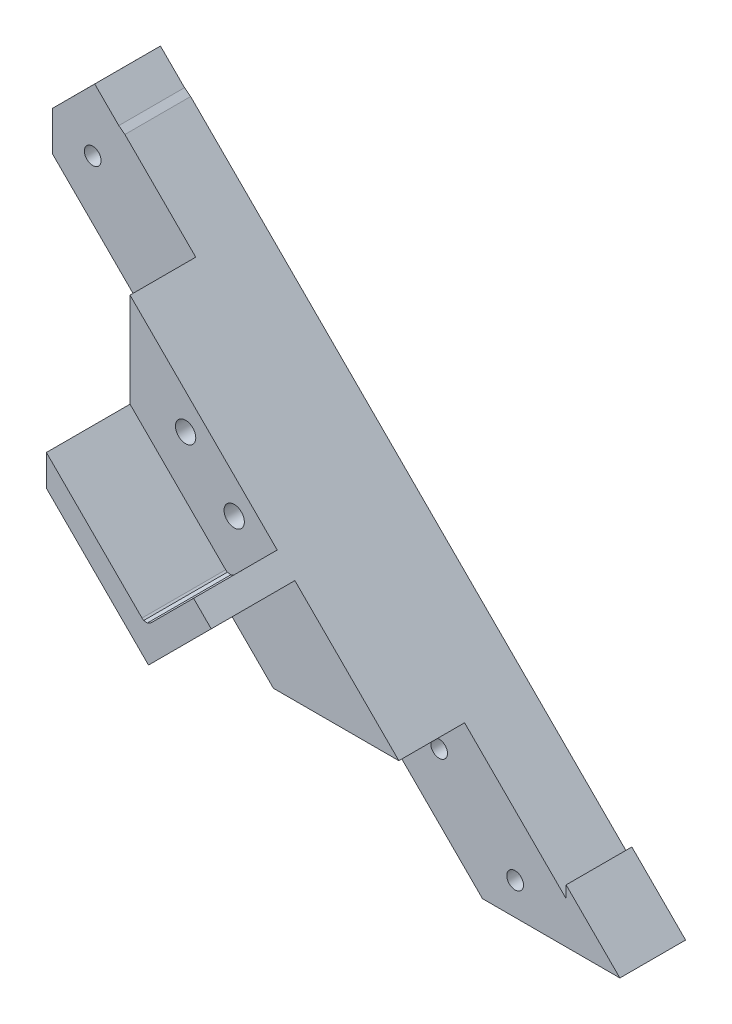
ISO-10303-21;
HEADER;
FILE_DESCRIPTION(('STEP AP214'),'2;1');
FILE_NAME('part.step','',(''),(''),'','','');
FILE_SCHEMA(('AUTOMOTIVE_DESIGN { 1 0 10303 214 1 1 1 1 }'));
ENDSEC;
DATA;
#1=APPLICATION_CONTEXT('core data for automotive mechanical design processes');
#2=APPLICATION_PROTOCOL_DEFINITION('international standard','automotive_design',2000,#1);
#3=PRODUCT_CONTEXT('',#1,'mechanical');
#4=PRODUCT('Part','Part','',(#3));
#5=PRODUCT_RELATED_PRODUCT_CATEGORY('part','',(#4));
#6=PRODUCT_DEFINITION_FORMATION('','',#4);
#7=PRODUCT_DEFINITION_CONTEXT('part definition',#1,'design');
#8=PRODUCT_DEFINITION('design','',#6,#7);
#9=PRODUCT_DEFINITION_SHAPE('','',#8);
#10=(LENGTH_UNIT() NAMED_UNIT(*) SI_UNIT(.MILLI.,.METRE.));
#11=(NAMED_UNIT(*) PLANE_ANGLE_UNIT() SI_UNIT($,.RADIAN.));
#12=(NAMED_UNIT(*) SI_UNIT($,.STERADIAN.) SOLID_ANGLE_UNIT());
#13=UNCERTAINTY_MEASURE_WITH_UNIT(LENGTH_MEASURE(1.E-05),#10,'distance_accuracy_value','');
#14=(GEOMETRIC_REPRESENTATION_CONTEXT(3) GLOBAL_UNCERTAINTY_ASSIGNED_CONTEXT((#13)) GLOBAL_UNIT_ASSIGNED_CONTEXT((#10,
#11,#12)) REPRESENTATION_CONTEXT('',''));
#15=CARTESIAN_POINT('',(0.,0.,0.));
#16=DIRECTION('',(0.,0.,1.));
#17=DIRECTION('',(1.,0.,0.));
#18=AXIS2_PLACEMENT_3D('',#15,#16,#17);
#19=CARTESIAN_POINT('',(78.736679994962,32.118448210166,41.));
#20=DIRECTION('',(0.,0.,1.));
#21=DIRECTION('',(1.,0.,0.));
#22=AXIS2_PLACEMENT_3D('',#19,#20,#21);
#23=PLANE('',#22);
#24=CARTESIAN_POINT('',(78.736679994962,32.118448210166,41.));
#25=DIRECTION('',(0.,0.,1.));
#26=DIRECTION('',(1.,0.,0.));
#27=AXIS2_PLACEMENT_3D('',#24,#25,#26);
#28=CIRCLE('',#27,1.4);
#29=CARTESIAN_POINT('',(80.136679994962,32.118448210166,41.));
#30=VERTEX_POINT('',#29);
#31=EDGE_CURVE('E9',#30,#30,#28,.T.);
#32=ORIENTED_EDGE('',*,*,#31,.T.);
#33=EDGE_LOOP('',(#32));
#34=FACE_BOUND('',#33,.T.);
#35=ADVANCED_FACE('F14',(#34),#23,.T.);
#36=CARTESIAN_POINT('',(91.46460205632,19.390526148808,41.));
#37=DIRECTION('',(0.,0.,1.));
#38=DIRECTION('',(1.,0.,0.));
#39=AXIS2_PLACEMENT_3D('',#36,#37,#38);
#40=PLANE('',#39);
#41=CARTESIAN_POINT('',(91.46460205632,19.390526148808,41.));
#42=DIRECTION('',(0.,0.,1.));
#43=DIRECTION('',(1.,0.,0.));
#44=AXIS2_PLACEMENT_3D('',#41,#42,#43);
#45=CIRCLE('',#44,1.4);
#46=CARTESIAN_POINT('',(92.86460205632,19.390526148808,41.));
#47=VERTEX_POINT('',#46);
#48=EDGE_CURVE('E401',#47,#47,#45,.T.);
#49=ORIENTED_EDGE('',*,*,#48,.T.);
#50=EDGE_LOOP('',(#49));
#51=FACE_BOUND('',#50,.T.);
#52=ADVANCED_FACE('F678',(#51),#40,.T.);
#53=CARTESIAN_POINT('',(20.751099636774,89.064753007087,41.));
#54=DIRECTION('',(0.,0.,1.));
#55=DIRECTION('',(1.,0.,0.));
#56=AXIS2_PLACEMENT_3D('',#53,#54,#55);
#57=PLANE('',#56);
#58=CARTESIAN_POINT('',(20.751099636774,89.064753007087,41.));
#59=DIRECTION('',(0.,0.,1.));
#60=DIRECTION('',(1.,0.,0.));
#61=AXIS2_PLACEMENT_3D('',#58,#59,#60);
#62=CIRCLE('',#61,1.4);
#63=CARTESIAN_POINT('',(22.151099636774,89.064753007087,41.));
#64=VERTEX_POINT('',#63);
#65=EDGE_CURVE('E365',#64,#64,#62,.T.);
#66=ORIENTED_EDGE('',*,*,#65,.T.);
#67=EDGE_LOOP('',(#66));
#68=FACE_BOUND('',#67,.T.);
#69=ADVANCED_FACE('F683',(#68),#57,.T.);
#70=CARTESIAN_POINT('',(33.479021698131,76.33683094573,41.));
#71=DIRECTION('',(0.,0.,1.));
#72=DIRECTION('',(1.,0.,0.));
#73=AXIS2_PLACEMENT_3D('',#70,#71,#72);
#74=PLANE('',#73);
#75=CARTESIAN_POINT('',(33.479021698131,76.33683094573,41.));
#76=DIRECTION('',(0.,0.,1.));
#77=DIRECTION('',(1.,0.,0.));
#78=AXIS2_PLACEMENT_3D('',#75,#76,#77);
#79=CIRCLE('',#78,1.4);
#80=CARTESIAN_POINT('',(34.879021698131,76.33683094573,41.));
#81=VERTEX_POINT('',#80);
#82=EDGE_CURVE('E495',#81,#81,#79,.T.);
#83=ORIENTED_EDGE('',*,*,#82,.T.);
#84=EDGE_LOOP('',(#83));
#85=FACE_BOUND('',#84,.T.);
#86=ADVANCED_FACE('F699',(#85),#74,.T.);
#87=CARTESIAN_POINT('',(47.30544366138,67.81154031579,43.9));
#88=DIRECTION('',(0.,0.,1.));
#89=DIRECTION('',(1.,0.,0.));
#90=AXIS2_PLACEMENT_3D('',#87,#88,#89);
#91=PLANE('',#90);
#92=CARTESIAN_POINT('',(47.30544366138,67.81154031579,43.9));
#93=DIRECTION('',(0.,0.,1.));
#94=DIRECTION('',(1.,0.,0.));
#95=AXIS2_PLACEMENT_3D('',#92,#93,#94);
#96=CIRCLE('',#95,1.7);
#97=CARTESIAN_POINT('',(49.00544366138,67.81154031579,43.9));
#98=VERTEX_POINT('',#97);
#99=EDGE_CURVE('E331',#98,#98,#96,.T.);
#100=ORIENTED_EDGE('',*,*,#99,.T.);
#101=EDGE_LOOP('',(#100));
#102=FACE_BOUND('',#101,.T.);
#103=CARTESIAN_POINT('',(47.30544366138,67.81154031579,43.9));
#104=DIRECTION('',(0.,0.,1.));
#105=DIRECTION('',(1.,0.,0.));
#106=AXIS2_PLACEMENT_3D('',#103,#104,#105);
#107=CIRCLE('',#106,3.6);
#108=CARTESIAN_POINT('',(50.90544366138,67.81154031579,43.9));
#109=VERTEX_POINT('',#108);
#110=EDGE_CURVE('E402',#109,#109,#107,.T.);
#111=ORIENTED_EDGE('',*,*,#110,.F.);
#112=EDGE_LOOP('',(#111));
#113=FACE_BOUND('',#112,.T.);
#114=ADVANCED_FACE('F16',(#102,#113),#91,.F.);
#115=CARTESIAN_POINT('',(55.437171645025,59.679812332145,43.9));
#116=DIRECTION('',(0.,0.,1.));
#117=DIRECTION('',(1.,0.,0.));
#118=AXIS2_PLACEMENT_3D('',#115,#116,#117);
#119=PLANE('',#118);
#120=CARTESIAN_POINT('',(55.437171645025,59.679812332145,43.9));
#121=DIRECTION('',(0.,0.,1.));
#122=DIRECTION('',(1.,0.,0.));
#123=AXIS2_PLACEMENT_3D('',#120,#121,#122);
#124=CIRCLE('',#123,1.7);
#125=CARTESIAN_POINT('',(57.137171645025,59.679812332145,43.9));
#126=VERTEX_POINT('',#125);
#127=EDGE_CURVE('E322',#126,#126,#124,.T.);
#128=ORIENTED_EDGE('',*,*,#127,.T.);
#129=EDGE_LOOP('',(#128));
#130=FACE_BOUND('',#129,.T.);
#131=CARTESIAN_POINT('',(55.437171645025,59.679812332145,43.9));
#132=DIRECTION('',(0.,0.,1.));
#133=DIRECTION('',(1.,0.,0.));
#134=AXIS2_PLACEMENT_3D('',#131,#132,#133);
#135=CIRCLE('',#134,3.6);
#136=CARTESIAN_POINT('',(59.037171645025,59.679812332145,43.9));
#137=VERTEX_POINT('',#136);
#138=EDGE_CURVE('E532',#137,#137,#135,.T.);
#139=ORIENTED_EDGE('',*,*,#138,.F.);
#140=EDGE_LOOP('',(#139));
#141=FACE_BOUND('',#140,.T.);
#142=ADVANCED_FACE('F746',(#130,#141),#119,.F.);
#143=CARTESIAN_POINT('',(78.736679994962,32.118448210166,41.));
#144=DIRECTION('',(0.,0.,1.));
#145=DIRECTION('',(1.,0.,0.));
#146=AXIS2_PLACEMENT_3D('',#143,#144,#145);
#147=CYLINDRICAL_SURFACE('',#146,1.4);
#148=DIRECTION('',(0.,0.,1.));
#149=VECTOR('',#148,1.);
#150=CARTESIAN_POINT('',(80.136679994962,32.118448210166,41.));
#151=LINE('',#150,#149);
#152=CARTESIAN_POINT('',(80.136679994962,32.118448210166,51.));
#153=VERTEX_POINT('',#152);
#154=EDGE_CURVE('E25',#30,#153,#151,.T.);
#155=ORIENTED_EDGE('',*,*,#154,.F.);
#156=ORIENTED_EDGE('',*,*,#31,.F.);
#157=ORIENTED_EDGE('',*,*,#154,.T.);
#158=CARTESIAN_POINT('',(78.736679994962,32.118448210166,51.));
#159=DIRECTION('',(0.,0.,1.));
#160=DIRECTION('',(1.,0.,0.));
#161=AXIS2_PLACEMENT_3D('',#158,#159,#160);
#162=CIRCLE('',#161,1.4);
#163=EDGE_CURVE('E452',#153,#153,#162,.T.);
#164=ORIENTED_EDGE('',*,*,#163,.T.);
#165=EDGE_LOOP('',(#155,#156,#157,#164));
#166=FACE_BOUND('',#165,.T.);
#167=ADVANCED_FACE('F694',(#166),#147,.F.);
#168=CARTESIAN_POINT('',(91.46460205632,19.390526148808,41.));
#169=DIRECTION('',(0.,0.,1.));
#170=DIRECTION('',(1.,0.,0.));
#171=AXIS2_PLACEMENT_3D('',#168,#169,#170);
#172=CYLINDRICAL_SURFACE('',#171,1.4);
#173=DIRECTION('',(0.,0.,1.));
#174=VECTOR('',#173,1.);
#175=CARTESIAN_POINT('',(92.86460205632,19.390526148808,41.));
#176=LINE('',#175,#174);
#177=CARTESIAN_POINT('',(92.86460205632,19.390526148808,51.));
#178=VERTEX_POINT('',#177);
#179=EDGE_CURVE('E398',#47,#178,#176,.T.);
#180=ORIENTED_EDGE('',*,*,#179,.F.);
#181=ORIENTED_EDGE('',*,*,#48,.F.);
#182=ORIENTED_EDGE('',*,*,#179,.T.);
#183=CARTESIAN_POINT('',(91.46460205632,19.390526148808,51.));
#184=DIRECTION('',(0.,0.,1.));
#185=DIRECTION('',(1.,0.,0.));
#186=AXIS2_PLACEMENT_3D('',#183,#184,#185);
#187=CIRCLE('',#186,1.4);
#188=EDGE_CURVE('E456',#178,#178,#187,.T.);
#189=ORIENTED_EDGE('',*,*,#188,.T.);
#190=EDGE_LOOP('',(#180,#181,#182,#189));
#191=FACE_BOUND('',#190,.T.);
#192=ADVANCED_FACE('F691',(#191),#172,.F.);
#193=CARTESIAN_POINT('',(47.30544366138,67.81154031579,39.9));
#194=DIRECTION('',(0.,0.,1.));
#195=DIRECTION('',(1.,0.,0.));
#196=AXIS2_PLACEMENT_3D('',#193,#194,#195);
#197=CYLINDRICAL_SURFACE('',#196,3.6);
#198=CARTESIAN_POINT('',(47.30544366138,67.81154031579,40.));
#199=DIRECTION('',(0.,0.,1.));
#200=DIRECTION('',(1.,0.,0.));
#201=AXIS2_PLACEMENT_3D('',#198,#199,#200);
#202=CIRCLE('',#201,3.6);
#203=CARTESIAN_POINT('',(50.90544366138,67.81154031579,40.));
#204=VERTEX_POINT('',#203);
#205=EDGE_CURVE('E317',#204,#204,#202,.T.);
#206=ORIENTED_EDGE('',*,*,#205,.F.);
#207=DIRECTION('',(0.,0.,1.));
#208=VECTOR('',#207,1.);
#209=CARTESIAN_POINT('',(50.90544366138,67.81154031579,39.9));
#210=LINE('',#209,#208);
#211=EDGE_CURVE('E505',#204,#109,#210,.T.);
#212=ORIENTED_EDGE('',*,*,#211,.T.);
#213=ORIENTED_EDGE('',*,*,#110,.T.);
#214=ORIENTED_EDGE('',*,*,#211,.F.);
#215=EDGE_LOOP('',(#206,#212,#213,#214));
#216=FACE_BOUND('',#215,.T.);
#217=ADVANCED_FACE('F693',(#216),#197,.F.);
#218=CARTESIAN_POINT('',(55.437171645025,59.679812332145,39.9));
#219=DIRECTION('',(0.,0.,1.));
#220=DIRECTION('',(1.,0.,0.));
#221=AXIS2_PLACEMENT_3D('',#218,#219,#220);
#222=CYLINDRICAL_SURFACE('',#221,3.6);
#223=CARTESIAN_POINT('',(55.437171645025,59.679812332145,40.));
#224=DIRECTION('',(0.,0.,1.));
#225=DIRECTION('',(1.,0.,0.));
#226=AXIS2_PLACEMENT_3D('',#223,#224,#225);
#227=CIRCLE('',#226,3.6);
#228=CARTESIAN_POINT('',(59.037171645025,59.679812332145,40.));
#229=VERTEX_POINT('',#228);
#230=EDGE_CURVE('E18',#229,#229,#227,.T.);
#231=ORIENTED_EDGE('',*,*,#230,.F.);
#232=DIRECTION('',(0.,0.,1.));
#233=VECTOR('',#232,1.);
#234=CARTESIAN_POINT('',(59.037171645025,59.679812332145,39.9));
#235=LINE('',#234,#233);
#236=EDGE_CURVE('E364',#229,#137,#235,.T.);
#237=ORIENTED_EDGE('',*,*,#236,.T.);
#238=ORIENTED_EDGE('',*,*,#138,.T.);
#239=ORIENTED_EDGE('',*,*,#236,.F.);
#240=EDGE_LOOP('',(#231,#237,#238,#239));
#241=FACE_BOUND('',#240,.T.);
#242=ADVANCED_FACE('F705',(#241),#222,.F.);
#243=CARTESIAN_POINT('',(109.,14.,40.));
#244=DIRECTION('',(-0.707106781186548,-0.707106781186548,0.));
#245=DIRECTION('',(-0.707106781186548,0.707106781186548,0.));
#246=AXIS2_PLACEMENT_3D('',#243,#244,#245);
#247=PLANE('',#246);
#248=DIRECTION('',(-0.707106781186548,0.707106781186548,0.));
#249=VECTOR('',#248,1.);
#250=CARTESIAN_POINT('',(109.,14.,40.));
#251=LINE('',#250,#249);
#252=CARTESIAN_POINT('',(109.,14.,40.));
#253=VERTEX_POINT('',#252);
#254=CARTESIAN_POINT('',(100.,23.,40.));
#255=VERTEX_POINT('',#254);
#256=EDGE_CURVE('E308',#253,#255,#251,.T.);
#257=ORIENTED_EDGE('',*,*,#256,.T.);
#258=DIRECTION('',(0.,0.,1.));
#259=VECTOR('',#258,1.);
#260=CARTESIAN_POINT('',(100.,23.,40.));
#261=LINE('',#260,#259);
#262=CARTESIAN_POINT('',(100.,23.,51.));
#263=VERTEX_POINT('',#262);
#264=EDGE_CURVE('E316',#255,#263,#261,.T.);
#265=ORIENTED_EDGE('',*,*,#264,.T.);
#266=DIRECTION('',(-0.707106781186548,0.707106781186548,0.));
#267=VECTOR('',#266,1.);
#268=CARTESIAN_POINT('',(109.,14.,51.));
#269=LINE('',#268,#267);
#270=CARTESIAN_POINT('',(109.,14.,51.));
#271=VERTEX_POINT('',#270);
#272=EDGE_CURVE('E351',#271,#263,#269,.T.);
#273=ORIENTED_EDGE('',*,*,#272,.F.);
#274=DIRECTION('',(0.,0.,1.));
#275=VECTOR('',#274,1.);
#276=CARTESIAN_POINT('',(109.,14.,40.));
#277=LINE('',#276,#275);
#278=EDGE_CURVE('E361',#253,#271,#277,.T.);
#279=ORIENTED_EDGE('',*,*,#278,.F.);
#280=EDGE_LOOP('',(#257,#265,#273,#279));
#281=FACE_BOUND('',#280,.T.);
#282=ADVANCED_FACE('F625',(#281),#247,.F.);
#283=CARTESIAN_POINT('',(86.,14.,40.));
#284=DIRECTION('',(0.,1.,0.));
#285=DIRECTION('',(1.,0.,0.));
#286=AXIS2_PLACEMENT_3D('',#283,#284,#285);
#287=PLANE('',#286);
#288=DIRECTION('',(1.,0.,0.));
#289=VECTOR('',#288,1.);
#290=CARTESIAN_POINT('',(86.,14.,40.));
#291=LINE('',#290,#289);
#292=CARTESIAN_POINT('',(86.,14.,40.));
#293=VERTEX_POINT('',#292);
#294=EDGE_CURVE('E312',#293,#253,#291,.T.);
#295=ORIENTED_EDGE('',*,*,#294,.T.);
#296=ORIENTED_EDGE('',*,*,#278,.T.);
#297=DIRECTION('',(1.,0.,0.));
#298=VECTOR('',#297,1.);
#299=CARTESIAN_POINT('',(86.,14.,51.));
#300=LINE('',#299,#298);
#301=CARTESIAN_POINT('',(86.,14.,51.));
#302=VERTEX_POINT('',#301);
#303=EDGE_CURVE('E350',#302,#271,#300,.T.);
#304=ORIENTED_EDGE('',*,*,#303,.F.);
#305=DIRECTION('',(0.,0.,1.));
#306=VECTOR('',#305,1.);
#307=CARTESIAN_POINT('',(86.,14.,40.));
#308=LINE('',#307,#306);
#309=EDGE_CURVE('E403',#293,#302,#308,.T.);
#310=ORIENTED_EDGE('',*,*,#309,.F.);
#311=EDGE_LOOP('',(#295,#296,#304,#310));
#312=FACE_BOUND('',#311,.T.);
#313=ADVANCED_FACE('F646',(#312),#287,.F.);
#314=CARTESIAN_POINT('',(20.751099636774,89.064753007087,41.));
#315=DIRECTION('',(0.,0.,1.));
#316=DIRECTION('',(1.,0.,0.));
#317=AXIS2_PLACEMENT_3D('',#314,#315,#316);
#318=CYLINDRICAL_SURFACE('',#317,1.4);
#319=DIRECTION('',(0.,0.,1.));
#320=VECTOR('',#319,1.);
#321=CARTESIAN_POINT('',(22.151099636774,89.064753007087,41.));
#322=LINE('',#321,#320);
#323=CARTESIAN_POINT('',(22.151099636774,89.064753007087,51.));
#324=VERTEX_POINT('',#323);
#325=EDGE_CURVE('E492',#64,#324,#322,.T.);
#326=ORIENTED_EDGE('',*,*,#325,.F.);
#327=ORIENTED_EDGE('',*,*,#65,.F.);
#328=ORIENTED_EDGE('',*,*,#325,.T.);
#329=CARTESIAN_POINT('',(20.751099636774,89.064753007087,51.));
#330=DIRECTION('',(0.,0.,1.));
#331=DIRECTION('',(1.,0.,0.));
#332=AXIS2_PLACEMENT_3D('',#329,#330,#331);
#333=CIRCLE('',#332,1.4);
#334=EDGE_CURVE('E412',#324,#324,#333,.T.);
#335=ORIENTED_EDGE('',*,*,#334,.T.);
#336=EDGE_LOOP('',(#326,#327,#328,#335));
#337=FACE_BOUND('',#336,.T.);
#338=ADVANCED_FACE('F714',(#337),#318,.F.);
#339=CARTESIAN_POINT('',(33.479021698131,76.33683094573,41.));
#340=DIRECTION('',(0.,0.,1.));
#341=DIRECTION('',(1.,0.,0.));
#342=AXIS2_PLACEMENT_3D('',#339,#340,#341);
#343=CYLINDRICAL_SURFACE('',#342,1.4);
#344=DIRECTION('',(0.,0.,1.));
#345=VECTOR('',#344,1.);
#346=CARTESIAN_POINT('',(34.879021698131,76.33683094573,41.));
#347=LINE('',#346,#345);
#348=CARTESIAN_POINT('',(34.879021698131,76.33683094573,51.));
#349=VERTEX_POINT('',#348);
#350=EDGE_CURVE('E301',#81,#349,#347,.T.);
#351=ORIENTED_EDGE('',*,*,#350,.F.);
#352=ORIENTED_EDGE('',*,*,#82,.F.);
#353=ORIENTED_EDGE('',*,*,#350,.T.);
#354=CARTESIAN_POINT('',(33.479021698131,76.33683094573,51.));
#355=DIRECTION('',(0.,0.,1.));
#356=DIRECTION('',(1.,0.,0.));
#357=AXIS2_PLACEMENT_3D('',#354,#355,#356);
#358=CIRCLE('',#357,1.4);
#359=EDGE_CURVE('E306',#349,#349,#358,.T.);
#360=ORIENTED_EDGE('',*,*,#359,.T.);
#361=EDGE_LOOP('',(#351,#352,#353,#360));
#362=FACE_BOUND('',#361,.T.);
#363=ADVANCED_FACE('F722',(#362),#343,.F.);
#364=CARTESIAN_POINT('',(25.120030213303,95.629065072163,40.));
#365=DIRECTION('',(-0.706795959357822,-0.707417466447822,0.));
#366=DIRECTION('',(-0.707417466447822,0.706795959357822,0.));
#367=AXIS2_PLACEMENT_3D('',#364,#365,#366);
#368=PLANE('',#367);
#369=DIRECTION('',(-0.707417466447822,0.706795959357822,0.));
#370=VECTOR('',#369,1.);
#371=CARTESIAN_POINT('',(25.120030213303,95.629065072163,40.));
#372=LINE('',#371,#370);
#373=CARTESIAN_POINT('',(25.120030213303,95.629065072163,40.));
#374=VERTEX_POINT('',#373);
#375=CARTESIAN_POINT('',(21.089185237676,99.656368717739,40.));
#376=VERTEX_POINT('',#375);
#377=EDGE_CURVE('E393',#374,#376,#372,.T.);
#378=ORIENTED_EDGE('',*,*,#377,.T.);
#379=DIRECTION('',(0.,0.,1.));
#380=VECTOR('',#379,1.);
#381=CARTESIAN_POINT('',(21.089185237676,99.656368717739,40.));
#382=LINE('',#381,#380);
#383=CARTESIAN_POINT('',(21.089185237676,99.656368717739,51.));
#384=VERTEX_POINT('',#383);
#385=EDGE_CURVE('E449',#376,#384,#382,.T.);
#386=ORIENTED_EDGE('',*,*,#385,.T.);
#387=DIRECTION('',(-0.707417466447822,0.706795959357822,0.));
#388=VECTOR('',#387,1.);
#389=CARTESIAN_POINT('',(25.120030213303,95.629065072163,51.));
#390=LINE('',#389,#388);
#391=CARTESIAN_POINT('',(25.120030213303,95.629065072163,51.));
#392=VERTEX_POINT('',#391);
#393=EDGE_CURVE('E366',#392,#384,#390,.T.);
#394=ORIENTED_EDGE('',*,*,#393,.F.);
#395=DIRECTION('',(0.,0.,1.));
#396=VECTOR('',#395,1.);
#397=CARTESIAN_POINT('',(25.120030213303,95.629065072163,40.));
#398=LINE('',#397,#396);
#399=EDGE_CURVE('E411',#374,#392,#398,.T.);
#400=ORIENTED_EDGE('',*,*,#399,.F.);
#401=EDGE_LOOP('',(#378,#386,#394,#400));
#402=FACE_BOUND('',#401,.T.);
#403=ADVANCED_FACE('F570',(#402),#368,.F.);
#404=CARTESIAN_POINT('',(21.089185237676,99.656368717739,40.));
#405=DIRECTION('',(0.707029670829544,-0.707183883135544,0.));
#406=DIRECTION('',(0.,0.,-1.));
#407=AXIS2_PLACEMENT_3D('',#404,#405,#406);
#408=PLANE('',#407);
#409=DIRECTION('',(-0.707183883135544,-0.707029670829544,0.));
#410=VECTOR('',#409,1.);
#411=CARTESIAN_POINT('',(21.089185237676,99.656368717739,40.));
#412=LINE('',#411,#410);
#413=CARTESIAN_POINT('',(14.,92.568729385773,40.));
#414=VERTEX_POINT('',#413);
#415=EDGE_CURVE('E397',#376,#414,#412,.T.);
#416=ORIENTED_EDGE('',*,*,#415,.T.);
#417=DIRECTION('',(0.,0.,1.));
#418=VECTOR('',#417,1.);
#419=CARTESIAN_POINT('',(14.,92.568729385773,40.));
#420=LINE('',#419,#418);
#421=CARTESIAN_POINT('',(14.,92.568729385773,51.));
#422=VERTEX_POINT('',#421);
#423=EDGE_CURVE('E334',#414,#422,#420,.T.);
#424=ORIENTED_EDGE('',*,*,#423,.T.);
#425=DIRECTION('',(-0.707183883135544,-0.707029670829544,0.));
#426=VECTOR('',#425,1.);
#427=CARTESIAN_POINT('',(21.089185237676,99.656368717739,51.));
#428=LINE('',#427,#426);
#429=EDGE_CURVE('E307',#384,#422,#428,.T.);
#430=ORIENTED_EDGE('',*,*,#429,.F.);
#431=ORIENTED_EDGE('',*,*,#385,.F.);
#432=EDGE_LOOP('',(#416,#424,#430,#431));
#433=FACE_BOUND('',#432,.T.);
#434=ADVANCED_FACE('F556',(#433),#408,.F.);
#435=CARTESIAN_POINT('',(14.,92.568729385773,40.));
#436=DIRECTION('',(1.,0.,0.));
#437=DIRECTION('',(0.,1.,0.));
#438=AXIS2_PLACEMENT_3D('',#435,#436,#437);
#439=PLANE('',#438);
#440=DIRECTION('',(0.,-1.,0.));
#441=VECTOR('',#440,1.);
#442=CARTESIAN_POINT('',(14.,92.568729385773,40.));
#443=LINE('',#442,#441);
#444=CARTESIAN_POINT('',(14.,86.,40.));
#445=VERTEX_POINT('',#444);
#446=EDGE_CURVE('E416',#414,#445,#443,.T.);
#447=ORIENTED_EDGE('',*,*,#446,.T.);
#448=DIRECTION('',(0.,0.,1.));
#449=VECTOR('',#448,1.);
#450=CARTESIAN_POINT('',(14.,86.,40.));
#451=LINE('',#450,#449);
#452=CARTESIAN_POINT('',(14.,86.,51.));
#453=VERTEX_POINT('',#452);
#454=EDGE_CURVE('E406',#445,#453,#451,.T.);
#455=ORIENTED_EDGE('',*,*,#454,.T.);
#456=DIRECTION('',(0.,-1.,0.));
#457=VECTOR('',#456,1.);
#458=CARTESIAN_POINT('',(14.,92.568729385773,51.));
#459=LINE('',#458,#457);
#460=EDGE_CURVE('E303',#422,#453,#459,.T.);
#461=ORIENTED_EDGE('',*,*,#460,.F.);
#462=ORIENTED_EDGE('',*,*,#423,.F.);
#463=EDGE_LOOP('',(#447,#455,#461,#462));
#464=FACE_BOUND('',#463,.T.);
#465=ADVANCED_FACE('F562',(#464),#439,.F.);
#466=CARTESIAN_POINT('',(47.30544366138,67.81154031579,39.9));
#467=DIRECTION('',(0.,0.,1.));
#468=DIRECTION('',(1.,0.,0.));
#469=AXIS2_PLACEMENT_3D('',#466,#467,#468);
#470=CYLINDRICAL_SURFACE('',#469,1.7);
#471=DIRECTION('',(0.,0.,1.));
#472=VECTOR('',#471,1.);
#473=CARTESIAN_POINT('',(49.00544366138,67.81154031579,39.9));
#474=LINE('',#473,#472);
#475=CARTESIAN_POINT('',(49.00544366138,67.81154031579,62.));
#476=VERTEX_POINT('',#475);
#477=EDGE_CURVE('E335',#98,#476,#474,.T.);
#478=ORIENTED_EDGE('',*,*,#477,.T.);
#479=CARTESIAN_POINT('',(47.30544366138,67.81154031579,62.));
#480=DIRECTION('',(0.,0.,1.));
#481=DIRECTION('',(1.,0.,0.));
#482=AXIS2_PLACEMENT_3D('',#479,#480,#481);
#483=CIRCLE('',#482,1.7);
#484=EDGE_CURVE('E388',#476,#476,#483,.T.);
#485=ORIENTED_EDGE('',*,*,#484,.T.);
#486=ORIENTED_EDGE('',*,*,#477,.F.);
#487=ORIENTED_EDGE('',*,*,#99,.F.);
#488=EDGE_LOOP('',(#478,#485,#486,#487));
#489=FACE_BOUND('',#488,.T.);
#490=ADVANCED_FACE('F709',(#489),#470,.F.);
#491=CARTESIAN_POINT('',(55.437171645025,59.679812332145,39.9));
#492=DIRECTION('',(0.,0.,1.));
#493=DIRECTION('',(1.,0.,0.));
#494=AXIS2_PLACEMENT_3D('',#491,#492,#493);
#495=CYLINDRICAL_SURFACE('',#494,1.7);
#496=DIRECTION('',(0.,0.,1.));
#497=VECTOR('',#496,1.);
#498=CARTESIAN_POINT('',(57.137171645025,59.679812332145,39.9));
#499=LINE('',#498,#497);
#500=CARTESIAN_POINT('',(57.137171645025,59.679812332145,62.));
#501=VERTEX_POINT('',#500);
#502=EDGE_CURVE('E319',#126,#501,#499,.T.);
#503=ORIENTED_EDGE('',*,*,#502,.T.);
#504=CARTESIAN_POINT('',(55.437171645025,59.679812332145,62.));
#505=DIRECTION('',(0.,0.,1.));
#506=DIRECTION('',(1.,0.,0.));
#507=AXIS2_PLACEMENT_3D('',#504,#505,#506);
#508=CIRCLE('',#507,1.7);
#509=EDGE_CURVE('E392',#501,#501,#508,.T.);
#510=ORIENTED_EDGE('',*,*,#509,.T.);
#511=ORIENTED_EDGE('',*,*,#502,.F.);
#512=ORIENTED_EDGE('',*,*,#127,.F.);
#513=EDGE_LOOP('',(#503,#510,#511,#512));
#514=FACE_BOUND('',#513,.T.);
#515=ADVANCED_FACE('F743',(#514),#495,.F.);
#516=CARTESIAN_POINT('',(12.523031907246,92.666172862065,60.));
#517=DIRECTION('',(0.707106781186548,0.707106781186548,0.));
#518=DIRECTION('',(0.,0.,-1.));
#519=AXIS2_PLACEMENT_3D('',#516,#517,#518);
#520=PLANE('',#519);
#521=DIRECTION('',(0.707106781186548,-0.707106781186548,0.));
#522=VECTOR('',#521,1.);
#523=CARTESIAN_POINT('',(35.104401558222,70.084803211088,62.));
#524=LINE('',#523,#522);
#525=CARTESIAN_POINT('',(38.,67.189204769311,62.));
#526=VERTEX_POINT('',#525);
#527=CARTESIAN_POINT('',(54.008815947029,51.180388822282,62.));
#528=VERTEX_POINT('',#527);
#529=EDGE_CURVE('E459',#526,#528,#524,.T.);
#530=ORIENTED_EDGE('',*,*,#529,.F.);
#531=DIRECTION('',(0.,0.,-1.));
#532=VECTOR('',#531,1.);
#533=CARTESIAN_POINT('',(38.,67.189204769311,60.5));
#534=LINE('',#533,#532);
#535=CARTESIAN_POINT('',(38.,67.189204769311,76.));
#536=VERTEX_POINT('',#535);
#537=EDGE_CURVE('E428',#536,#526,#534,.T.);
#538=ORIENTED_EDGE('',*,*,#537,.F.);
#539=DIRECTION('',(0.707106781186548,-0.707106781186548,0.));
#540=VECTOR('',#539,1.);
#541=CARTESIAN_POINT('',(35.104401558222,70.084803211088,76.));
#542=LINE('',#541,#540);
#543=CARTESIAN_POINT('',(54.008815947029,51.180388822282,76.));
#544=VERTEX_POINT('',#543);
#545=EDGE_CURVE('E285',#536,#544,#542,.T.);
#546=ORIENTED_EDGE('',*,*,#545,.T.);
#547=DIRECTION('',(0.,0.,1.));
#548=VECTOR('',#547,1.);
#549=CARTESIAN_POINT('',(54.008815947029,51.180388822282,60.));
#550=LINE('',#549,#548);
#551=EDGE_CURVE('E274',#528,#544,#550,.T.);
#552=ORIENTED_EDGE('',*,*,#551,.F.);
#553=EDGE_LOOP('',(#530,#538,#546,#552));
#554=FACE_BOUND('',#553,.T.);
#555=ADVANCED_FACE('F584',(#554),#520,.T.);
#556=CARTESIAN_POINT('',(54.008815947029,51.180388822282,60.));
#557=DIRECTION('',(0.575863900041016,0.817545575873022,0.));
#558=DIRECTION('',(0.,0.,-1.));
#559=AXIS2_PLACEMENT_3D('',#556,#557,#558);
#560=PLANE('',#559);
#561=DIRECTION('',(0.817545575873022,-0.575863900041016,0.));
#562=VECTOR('',#561,1.);
#563=CARTESIAN_POINT('',(56.160447927529,49.66481926835,62.));
#564=LINE('',#563,#562);
#565=CARTESIAN_POINT('',(54.293948355946,50.979546855946,62.));
#566=VERTEX_POINT('',#565);
#567=EDGE_CURVE('E345',#528,#566,#564,.T.);
#568=ORIENTED_EDGE('',*,*,#567,.F.);
#569=ORIENTED_EDGE('',*,*,#551,.T.);
#570=DIRECTION('',(0.817545575873022,-0.575863900041016,0.));
#571=VECTOR('',#570,1.);
#572=CARTESIAN_POINT('',(56.160447927529,49.66481926835,76.));
#573=LINE('',#572,#571);
#574=CARTESIAN_POINT('',(54.293948355946,50.979546855946,76.));
#575=VERTEX_POINT('',#574);
#576=EDGE_CURVE('E278',#544,#575,#573,.T.);
#577=ORIENTED_EDGE('',*,*,#576,.T.);
#578=DIRECTION('',(0.,0.,1.));
#579=VECTOR('',#578,1.);
#580=CARTESIAN_POINT('',(54.293948355946,50.979546855946,60.));
#581=LINE('',#580,#579);
#582=EDGE_CURVE('E263',#566,#575,#581,.T.);
#583=ORIENTED_EDGE('',*,*,#582,.F.);
#584=EDGE_LOOP('',(#568,#569,#577,#583));
#585=FACE_BOUND('',#584,.T.);
#586=ADVANCED_FACE('F279',(#585),#560,.T.);
#587=CARTESIAN_POINT('',(54.293948355946,50.979546855946,60.));
#588=DIRECTION('',(0.146730474453997,0.989176509964983,0.));
#589=DIRECTION('',(0.,0.,-1.));
#590=AXIS2_PLACEMENT_3D('',#587,#588,#589);
#591=PLANE('',#590);
#592=DIRECTION('',(0.989176509964983,-0.146730474453997,0.));
#593=VECTOR('',#592,1.);
#594=CARTESIAN_POINT('',(56.44720592198,50.660141268468,62.));
#595=LINE('',#594,#593);
#596=CARTESIAN_POINT('',(54.87973348691,50.892653840061,62.));
#597=VERTEX_POINT('',#596);
#598=EDGE_CURVE('E269',#566,#597,#595,.T.);
#599=ORIENTED_EDGE('',*,*,#598,.F.);
#600=ORIENTED_EDGE('',*,*,#582,.T.);
#601=DIRECTION('',(0.989176509964983,-0.146730474453997,0.));
#602=VECTOR('',#601,1.);
#603=CARTESIAN_POINT('',(56.44720592198,50.660141268468,76.));
#604=LINE('',#603,#602);
#605=CARTESIAN_POINT('',(54.87973348691,50.892653840061,76.));
#606=VERTEX_POINT('',#605);
#607=EDGE_CURVE('E267',#575,#606,#604,.T.);
#608=ORIENTED_EDGE('',*,*,#607,.T.);
#609=DIRECTION('',(0.,0.,1.));
#610=VECTOR('',#609,1.);
#611=CARTESIAN_POINT('',(54.87973348691,50.892653840061,60.));
#612=LINE('',#611,#610);
#613=EDGE_CURVE('E275',#597,#606,#612,.T.);
#614=ORIENTED_EDGE('',*,*,#613,.F.);
#615=EDGE_LOOP('',(#599,#600,#608,#614));
#616=FACE_BOUND('',#615,.T.);
#617=ADVANCED_FACE('F265',(#616),#591,.T.);
#618=CARTESIAN_POINT('',(54.87973348691,50.892653840061,60.));
#619=DIRECTION('',(-0.428059522707111,0.903750543579234,0.));
#620=DIRECTION('',(0.,0.,1.));
#621=AXIS2_PLACEMENT_3D('',#618,#619,#620);
#622=PLANE('',#621);
#623=DIRECTION('',(0.903750543579234,0.428059522707111,0.));
#624=VECTOR('',#623,1.);
#625=CARTESIAN_POINT('',(55.719042226004,51.29019063914,62.));
#626=LINE('',#625,#624);
#627=CARTESIAN_POINT('',(55.41576595431,51.146544478114,62.));
#628=VERTEX_POINT('',#627);
#629=EDGE_CURVE('E186',#597,#628,#626,.T.);
#630=ORIENTED_EDGE('',*,*,#629,.F.);
#631=ORIENTED_EDGE('',*,*,#613,.T.);
#632=DIRECTION('',(0.903750543579234,0.428059522707111,0.));
#633=VECTOR('',#632,1.);
#634=CARTESIAN_POINT('',(55.719042226004,51.29019063914,76.));
#635=LINE('',#634,#633);
#636=CARTESIAN_POINT('',(55.41576595431,51.146544478114,76.));
#637=VERTEX_POINT('',#636);
#638=EDGE_CURVE('E290',#606,#637,#635,.T.);
#639=ORIENTED_EDGE('',*,*,#638,.T.);
#640=DIRECTION('',(0.,0.,1.));
#641=VECTOR('',#640,1.);
#642=CARTESIAN_POINT('',(55.41576595431,51.146544478114,60.));
#643=LINE('',#642,#641);
#644=EDGE_CURVE('E387',#628,#637,#643,.T.);
#645=ORIENTED_EDGE('',*,*,#644,.F.);
#646=EDGE_LOOP('',(#630,#631,#639,#645));
#647=FACE_BOUND('',#646,.T.);
#648=ADVANCED_FACE('F770',(#647),#622,.T.);
#649=CARTESIAN_POINT('',(38.,62.,40.));
#650=DIRECTION('',(0.707106781186548,0.707106781186548,0.));
#651=DIRECTION('',(0.,0.,-1.));
#652=AXIS2_PLACEMENT_3D('',#649,#650,#651);
#653=PLANE('',#652);
#654=DIRECTION('',(0.707106781186548,-0.707106781186548,0.));
#655=VECTOR('',#654,1.);
#656=CARTESIAN_POINT('',(14.,86.,51.));
#657=LINE('',#656,#655);
#658=CARTESIAN_POINT('',(38.,62.,51.));
#659=VERTEX_POINT('',#658);
#660=EDGE_CURVE('E338',#453,#659,#657,.T.);
#661=ORIENTED_EDGE('',*,*,#660,.F.);
#662=ORIENTED_EDGE('',*,*,#454,.F.);
#663=DIRECTION('',(-0.707106781186548,0.707106781186548,0.));
#664=VECTOR('',#663,1.);
#665=CARTESIAN_POINT('',(86.,14.,40.));
#666=LINE('',#665,#664);
#667=EDGE_CURVE('E515',#293,#445,#666,.T.);
#668=ORIENTED_EDGE('',*,*,#667,.F.);
#669=ORIENTED_EDGE('',*,*,#309,.T.);
#670=DIRECTION('',(0.707106781186548,-0.707106781186548,0.));
#671=VECTOR('',#670,1.);
#672=CARTESIAN_POINT('',(62.,38.,51.));
#673=LINE('',#672,#671);
#674=CARTESIAN_POINT('',(62.,38.,51.));
#675=VERTEX_POINT('',#674);
#676=EDGE_CURVE('E346',#675,#302,#673,.T.);
#677=ORIENTED_EDGE('',*,*,#676,.F.);
#678=DIRECTION('',(0.,0.,1.));
#679=VECTOR('',#678,1.);
#680=CARTESIAN_POINT('',(62.,38.,40.));
#681=LINE('',#680,#679);
#682=CARTESIAN_POINT('',(62.,38.,62.));
#683=VERTEX_POINT('',#682);
#684=EDGE_CURVE('E432',#675,#683,#681,.T.);
#685=ORIENTED_EDGE('',*,*,#684,.T.);
#686=DIRECTION('',(0.707106781186548,-0.707106781186548,0.));
#687=VECTOR('',#686,1.);
#688=CARTESIAN_POINT('',(38.,62.,62.));
#689=LINE('',#688,#687);
#690=CARTESIAN_POINT('',(55.091168824543,44.908831175457,62.));
#691=VERTEX_POINT('',#690);
#692=EDGE_CURVE('E384',#691,#683,#689,.T.);
#693=ORIENTED_EDGE('',*,*,#692,.F.);
#694=DIRECTION('',(0.,0.,1.));
#695=VECTOR('',#694,1.);
#696=CARTESIAN_POINT('',(55.091168824543,44.908831175457,61.5));
#697=LINE('',#696,#695);
#698=CARTESIAN_POINT('',(55.091168824543,44.908831175457,76.));
#699=VERTEX_POINT('',#698);
#700=EDGE_CURVE('E383',#691,#699,#697,.T.);
#701=ORIENTED_EDGE('',*,*,#700,.T.);
#702=DIRECTION('',(0.707106781186548,-0.707106781186548,0.));
#703=VECTOR('',#702,1.);
#704=CARTESIAN_POINT('',(46.545584412272,53.454415587728,76.));
#705=LINE('',#704,#703);
#706=CARTESIAN_POINT('',(38.,62.,76.));
#707=VERTEX_POINT('',#706);
#708=EDGE_CURVE('E323',#707,#699,#705,.T.);
#709=ORIENTED_EDGE('',*,*,#708,.F.);
#710=DIRECTION('',(0.,0.,1.));
#711=VECTOR('',#710,1.);
#712=CARTESIAN_POINT('',(38.,62.,51.));
#713=LINE('',#712,#711);
#714=EDGE_CURVE('E174',#659,#707,#713,.T.);
#715=ORIENTED_EDGE('',*,*,#714,.F.);
#716=EDGE_LOOP('',(#661,#662,#668,#669,#677,#685,#693,#701,#709,#715));
#717=FACE_BOUND('',#716,.T.);
#718=ADVANCED_FACE('F643',(#717),#653,.F.);
#719=CARTESIAN_POINT('',(85.737830503261,25.628879643258,51.));
#720=DIRECTION('',(0.,0.,1.));
#721=DIRECTION('',(1.,0.,0.));
#722=AXIS2_PLACEMENT_3D('',#719,#720,#721);
#723=PLANE('',#722);
#724=ORIENTED_EDGE('',*,*,#163,.F.);
#725=EDGE_LOOP('',(#724));
#726=FACE_BOUND('',#725,.T.);
#727=ORIENTED_EDGE('',*,*,#188,.F.);
#728=EDGE_LOOP('',(#727));
#729=FACE_BOUND('',#728,.T.);
#730=ORIENTED_EDGE('',*,*,#272,.T.);
#731=DIRECTION('',(0.,-1.,0.));
#732=VECTOR('',#731,1.);
#733=CARTESIAN_POINT('',(100.,23.,51.));
#734=LINE('',#733,#732);
#735=CARTESIAN_POINT('',(100.,21.,51.));
#736=VERTEX_POINT('',#735);
#737=EDGE_CURVE('E314',#263,#736,#734,.T.);
#738=ORIENTED_EDGE('',*,*,#737,.T.);
#739=DIRECTION('',(-0.707106781186548,0.707106781186548,0.));
#740=VECTOR('',#739,1.);
#741=CARTESIAN_POINT('',(100.,21.,51.));
#742=LINE('',#741,#740);
#743=CARTESIAN_POINT('',(83.,38.,51.));
#744=VERTEX_POINT('',#743);
#745=EDGE_CURVE('E506',#736,#744,#742,.T.);
#746=ORIENTED_EDGE('',*,*,#745,.T.);
#747=DIRECTION('',(-1.,0.,0.));
#748=VECTOR('',#747,1.);
#749=CARTESIAN_POINT('',(83.,38.,51.));
#750=LINE('',#749,#748);
#751=EDGE_CURVE('E436',#744,#675,#750,.T.);
#752=ORIENTED_EDGE('',*,*,#751,.T.);
#753=ORIENTED_EDGE('',*,*,#676,.T.);
#754=ORIENTED_EDGE('',*,*,#303,.T.);
#755=EDGE_LOOP('',(#730,#738,#746,#752,#753,#754));
#756=FACE_BOUND('',#755,.T.);
#757=ADVANCED_FACE('F622',(#726,#729,#756),#723,.T.);
#758=CARTESIAN_POINT('',(100.,23.,40.));
#759=DIRECTION('',(1.,0.,0.));
#760=DIRECTION('',(0.,1.,0.));
#761=AXIS2_PLACEMENT_3D('',#758,#759,#760);
#762=PLANE('',#761);
#763=DIRECTION('',(0.,-1.,0.));
#764=VECTOR('',#763,1.);
#765=CARTESIAN_POINT('',(100.,23.,40.));
#766=LINE('',#765,#764);
#767=CARTESIAN_POINT('',(100.,21.,40.));
#768=VERTEX_POINT('',#767);
#769=EDGE_CURVE('E313',#255,#768,#766,.T.);
#770=ORIENTED_EDGE('',*,*,#769,.T.);
#771=DIRECTION('',(0.,0.,1.));
#772=VECTOR('',#771,1.);
#773=CARTESIAN_POINT('',(100.,21.,40.));
#774=LINE('',#773,#772);
#775=EDGE_CURVE('E502',#768,#736,#774,.T.);
#776=ORIENTED_EDGE('',*,*,#775,.T.);
#777=ORIENTED_EDGE('',*,*,#737,.F.);
#778=ORIENTED_EDGE('',*,*,#264,.F.);
#779=EDGE_LOOP('',(#770,#776,#777,#778));
#780=FACE_BOUND('',#779,.T.);
#781=ADVANCED_FACE('F630',(#780),#762,.F.);
#782=CARTESIAN_POINT('',(56.367038424778,56.367038424778,40.));
#783=DIRECTION('',(0.,0.,1.));
#784=DIRECTION('',(1.,0.,0.));
#785=AXIS2_PLACEMENT_3D('',#782,#783,#784);
#786=PLANE('',#785);
#787=ORIENTED_EDGE('',*,*,#205,.T.);
#788=EDGE_LOOP('',(#787));
#789=FACE_BOUND('',#788,.T.);
#790=ORIENTED_EDGE('',*,*,#230,.T.);
#791=EDGE_LOOP('',(#790));
#792=FACE_BOUND('',#791,.T.);
#793=ORIENTED_EDGE('',*,*,#446,.F.);
#794=ORIENTED_EDGE('',*,*,#415,.F.);
#795=ORIENTED_EDGE('',*,*,#377,.F.);
#796=DIRECTION('',(-0.798434914372114,0.602081130340086,0.));
#797=VECTOR('',#796,1.);
#798=CARTESIAN_POINT('',(26.140285999316,94.859714000684,40.));
#799=LINE('',#798,#797);
#800=CARTESIAN_POINT('',(26.140285999316,94.859714000684,40.));
#801=VERTEX_POINT('',#800);
#802=EDGE_CURVE('E407',#801,#374,#799,.T.);
#803=ORIENTED_EDGE('',*,*,#802,.F.);
#804=DIRECTION('',(-0.707106781186548,0.707106781186548,0.));
#805=VECTOR('',#804,1.);
#806=CARTESIAN_POINT('',(100.,21.,40.));
#807=LINE('',#806,#805);
#808=EDGE_CURVE('E498',#768,#801,#807,.T.);
#809=ORIENTED_EDGE('',*,*,#808,.F.);
#810=ORIENTED_EDGE('',*,*,#769,.F.);
#811=ORIENTED_EDGE('',*,*,#256,.F.);
#812=ORIENTED_EDGE('',*,*,#294,.F.);
#813=ORIENTED_EDGE('',*,*,#667,.T.);
#814=EDGE_LOOP('',(#793,#794,#795,#803,#809,#810,#811,#812,#813));
#815=FACE_BOUND('',#814,.T.);
#816=ADVANCED_FACE('F648',(#789,#792,#815),#786,.F.);
#817=CARTESIAN_POINT('',(26.140285999316,94.859714000684,40.));
#818=DIRECTION('',(-0.602081130340086,-0.798434914372114,0.));
#819=DIRECTION('',(-0.798434914372114,0.602081130340086,0.));
#820=AXIS2_PLACEMENT_3D('',#817,#818,#819);
#821=PLANE('',#820);
#822=ORIENTED_EDGE('',*,*,#802,.T.);
#823=ORIENTED_EDGE('',*,*,#399,.T.);
#824=DIRECTION('',(-0.798434914372114,0.602081130340086,0.));
#825=VECTOR('',#824,1.);
#826=CARTESIAN_POINT('',(26.140285999316,94.859714000684,51.));
#827=LINE('',#826,#825);
#828=CARTESIAN_POINT('',(26.140285999316,94.859714000684,51.));
#829=VERTEX_POINT('',#828);
#830=EDGE_CURVE('E341',#829,#392,#827,.T.);
#831=ORIENTED_EDGE('',*,*,#830,.F.);
#832=DIRECTION('',(0.,0.,1.));
#833=VECTOR('',#832,1.);
#834=CARTESIAN_POINT('',(26.140285999316,94.859714000684,40.));
#835=LINE('',#834,#833);
#836=EDGE_CURVE('E425',#801,#829,#835,.T.);
#837=ORIENTED_EDGE('',*,*,#836,.F.);
#838=EDGE_LOOP('',(#822,#823,#831,#837));
#839=FACE_BOUND('',#838,.T.);
#840=ADVANCED_FACE('F653',(#839),#821,.F.);
#841=CARTESIAN_POINT('',(27.818309354856,81.376338859681,51.));
#842=DIRECTION('',(0.,0.,1.));
#843=DIRECTION('',(1.,0.,0.));
#844=AXIS2_PLACEMENT_3D('',#841,#842,#843);
#845=PLANE('',#844);
#846=ORIENTED_EDGE('',*,*,#334,.F.);
#847=EDGE_LOOP('',(#846));
#848=FACE_BOUND('',#847,.T.);
#849=ORIENTED_EDGE('',*,*,#359,.F.);
#850=EDGE_LOOP('',(#849));
#851=FACE_BOUND('',#850,.T.);
#852=ORIENTED_EDGE('',*,*,#660,.T.);
#853=DIRECTION('',(0.,1.,0.));
#854=VECTOR('',#853,1.);
#855=CARTESIAN_POINT('',(38.,62.,51.));
#856=LINE('',#855,#854);
#857=CARTESIAN_POINT('',(38.,83.,51.));
#858=VERTEX_POINT('',#857);
#859=EDGE_CURVE('E342',#659,#858,#856,.T.);
#860=ORIENTED_EDGE('',*,*,#859,.T.);
#861=DIRECTION('',(-0.707106781186548,0.707106781186548,0.));
#862=VECTOR('',#861,1.);
#863=CARTESIAN_POINT('',(38.,83.,51.));
#864=LINE('',#863,#862);
#865=EDGE_CURVE('E421',#858,#829,#864,.T.);
#866=ORIENTED_EDGE('',*,*,#865,.T.);
#867=ORIENTED_EDGE('',*,*,#830,.T.);
#868=ORIENTED_EDGE('',*,*,#393,.T.);
#869=ORIENTED_EDGE('',*,*,#429,.T.);
#870=ORIENTED_EDGE('',*,*,#460,.T.);
#871=EDGE_LOOP('',(#852,#860,#866,#867,#868,#869,#870));
#872=FACE_BOUND('',#871,.T.);
#873=ADVANCED_FACE('F565',(#848,#851,#872),#845,.T.);
#874=CARTESIAN_POINT('',(38.,83.,40.));
#875=DIRECTION('',(1.,0.,0.));
#876=DIRECTION('',(0.,1.,0.));
#877=AXIS2_PLACEMENT_3D('',#874,#875,#876);
#878=PLANE('',#877);
#879=ORIENTED_EDGE('',*,*,#714,.T.);
#880=DIRECTION('',(0.,-1.,0.));
#881=VECTOR('',#880,1.);
#882=CARTESIAN_POINT('',(38.,65.541630560343,76.));
#883=LINE('',#882,#881);
#884=EDGE_CURVE('E327',#536,#707,#883,.T.);
#885=ORIENTED_EDGE('',*,*,#884,.F.);
#886=ORIENTED_EDGE('',*,*,#537,.T.);
#887=DIRECTION('',(0.,-1.,0.));
#888=VECTOR('',#887,1.);
#889=CARTESIAN_POINT('',(38.,83.,62.));
#890=LINE('',#889,#888);
#891=CARTESIAN_POINT('',(38.,83.,62.));
#892=VERTEX_POINT('',#891);
#893=EDGE_CURVE('E462',#892,#526,#890,.T.);
#894=ORIENTED_EDGE('',*,*,#893,.F.);
#895=DIRECTION('',(0.,0.,1.));
#896=VECTOR('',#895,1.);
#897=CARTESIAN_POINT('',(38.,83.,40.));
#898=LINE('',#897,#896);
#899=EDGE_CURVE('E378',#858,#892,#898,.T.);
#900=ORIENTED_EDGE('',*,*,#899,.F.);
#901=ORIENTED_EDGE('',*,*,#859,.F.);
#902=EDGE_LOOP('',(#879,#885,#886,#894,#900,#901));
#903=FACE_BOUND('',#902,.T.);
#904=ADVANCED_FACE('F654',(#903),#878,.F.);
#905=CARTESIAN_POINT('',(56.367038424778,56.367038424778,62.));
#906=DIRECTION('',(0.,0.,1.));
#907=DIRECTION('',(1.,0.,0.));
#908=AXIS2_PLACEMENT_3D('',#905,#906,#907);
#909=PLANE('',#908);
#910=ORIENTED_EDGE('',*,*,#484,.F.);
#911=EDGE_LOOP('',(#910));
#912=FACE_BOUND('',#911,.T.);
#913=ORIENTED_EDGE('',*,*,#509,.F.);
#914=EDGE_LOOP('',(#913));
#915=FACE_BOUND('',#914,.T.);
#916=DIRECTION('',(0.707149518526953,0.707064041262953,0.));
#917=VECTOR('',#916,1.);
#918=CARTESIAN_POINT('',(55.362489448573,51.093274412218,62.));
#919=LINE('',#918,#917);
#920=CARTESIAN_POINT('',(62.635047056286,58.364952943714,62.));
#921=VERTEX_POINT('',#920);
#922=EDGE_CURVE('E326',#628,#921,#919,.T.);
#923=ORIENTED_EDGE('',*,*,#922,.T.);
#924=DIRECTION('',(-0.707106781186548,0.707106781186548,0.));
#925=VECTOR('',#924,1.);
#926=CARTESIAN_POINT('',(83.,38.,62.));
#927=LINE('',#926,#925);
#928=EDGE_CURVE('E359',#921,#892,#927,.T.);
#929=ORIENTED_EDGE('',*,*,#928,.T.);
#930=ORIENTED_EDGE('',*,*,#893,.T.);
#931=ORIENTED_EDGE('',*,*,#529,.T.);
#932=ORIENTED_EDGE('',*,*,#567,.T.);
#933=ORIENTED_EDGE('',*,*,#598,.T.);
#934=ORIENTED_EDGE('',*,*,#629,.T.);
#935=EDGE_LOOP('',(#923,#929,#930,#931,#932,#933,#934));
#936=FACE_BOUND('',#935,.T.);
#937=ADVANCED_FACE('F586',(#912,#915,#936),#909,.T.);
#938=CARTESIAN_POINT('',(55.41576595431,51.146544478114,60.));
#939=DIRECTION('',(-0.707064041262953,0.707149518526953,0.));
#940=DIRECTION('',(0.,0.,1.));
#941=AXIS2_PLACEMENT_3D('',#938,#939,#940);
#942=PLANE('',#941);
#943=ORIENTED_EDGE('',*,*,#922,.F.);
#944=ORIENTED_EDGE('',*,*,#644,.T.);
#945=DIRECTION('',(0.707149518526953,0.707064041262953,0.));
#946=VECTOR('',#945,1.);
#947=CARTESIAN_POINT('',(55.362489448573,51.093274412218,76.));
#948=LINE('',#947,#946);
#949=CARTESIAN_POINT('',(62.635047056286,58.364952943714,76.));
#950=VERTEX_POINT('',#949);
#951=EDGE_CURVE('E297',#637,#950,#948,.T.);
#952=ORIENTED_EDGE('',*,*,#951,.T.);
#953=DIRECTION('',(0.,0.,1.));
#954=VECTOR('',#953,1.);
#955=CARTESIAN_POINT('',(62.635047056286,58.364952943714,60.5));
#956=LINE('',#955,#954);
#957=EDGE_CURVE('E355',#921,#950,#956,.T.);
#958=ORIENTED_EDGE('',*,*,#957,.F.);
#959=EDGE_LOOP('',(#943,#944,#952,#958));
#960=FACE_BOUND('',#959,.T.);
#961=ADVANCED_FACE('F659',(#960),#942,.T.);
#962=CARTESIAN_POINT('',(58.265598769772,48.083261120685,76.));
#963=DIRECTION('',(0.,0.,1.));
#964=DIRECTION('',(1.,0.,0.));
#965=AXIS2_PLACEMENT_3D('',#962,#963,#964);
#966=PLANE('',#965);
#967=ORIENTED_EDGE('',*,*,#951,.F.);
#968=ORIENTED_EDGE('',*,*,#638,.F.);
#969=ORIENTED_EDGE('',*,*,#607,.F.);
#970=ORIENTED_EDGE('',*,*,#576,.F.);
#971=ORIENTED_EDGE('',*,*,#545,.F.);
#972=ORIENTED_EDGE('',*,*,#884,.T.);
#973=ORIENTED_EDGE('',*,*,#708,.T.);
#974=DIRECTION('',(-0.707106781186548,-0.707106781186548,0.));
#975=VECTOR('',#974,1.);
#976=CARTESIAN_POINT('',(66.892301500247,56.709963851161,76.));
#977=LINE('',#976,#975);
#978=CARTESIAN_POINT('',(65.591168824543,55.408831175457,76.));
#979=VERTEX_POINT('',#978);
#980=EDGE_CURVE('E379',#979,#699,#977,.T.);
#981=ORIENTED_EDGE('',*,*,#980,.F.);
#982=DIRECTION('',(-0.707106781186548,0.707106781186548,0.));
#983=VECTOR('',#982,1.);
#984=CARTESIAN_POINT('',(74.295584412272,46.704415587728,76.));
#985=LINE('',#984,#983);
#986=EDGE_CURVE('E358',#979,#950,#985,.T.);
#987=ORIENTED_EDGE('',*,*,#986,.T.);
#988=EDGE_LOOP('',(#967,#968,#969,#970,#971,#972,#973,#981,#987));
#989=FACE_BOUND('',#988,.T.);
#990=ADVANCED_FACE('F288',(#989),#966,.T.);
#991=CARTESIAN_POINT('',(58.265598769772,48.083261120685,62.));
#992=DIRECTION('',(-0.707106781186548,0.707106781186548,0.));
#993=DIRECTION('',(0.,0.,1.));
#994=AXIS2_PLACEMENT_3D('',#991,#992,#993);
#995=PLANE('',#994);
#996=DIRECTION('',(-0.707106781186548,-0.707106781186548,0.));
#997=VECTOR('',#996,1.);
#998=CARTESIAN_POINT('',(66.892301500247,56.709963851161,62.));
#999=LINE('',#998,#997);
#1000=CARTESIAN_POINT('',(65.591168824543,55.408831175457,62.));
#1001=VERTEX_POINT('',#1000);
#1002=EDGE_CURVE('E545',#1001,#691,#999,.T.);
#1003=ORIENTED_EDGE('',*,*,#1002,.F.);
#1004=DIRECTION('',(0.,0.,-1.));
#1005=VECTOR('',#1004,1.);
#1006=CARTESIAN_POINT('',(65.591168824543,55.408831175457,61.5));
#1007=LINE('',#1006,#1005);
#1008=EDGE_CURVE('E370',#979,#1001,#1007,.T.);
#1009=ORIENTED_EDGE('',*,*,#1008,.F.);
#1010=ORIENTED_EDGE('',*,*,#980,.T.);
#1011=ORIENTED_EDGE('',*,*,#700,.F.);
#1012=EDGE_LOOP('',(#1003,#1009,#1010,#1011));
#1013=FACE_BOUND('',#1012,.T.);
#1014=ADVANCED_FACE('F663',(#1013),#995,.F.);
#1015=CARTESIAN_POINT('',(56.367038424778,56.367038424778,62.));
#1016=DIRECTION('',(0.,0.,1.));
#1017=DIRECTION('',(1.,0.,0.));
#1018=AXIS2_PLACEMENT_3D('',#1015,#1016,#1017);
#1019=PLANE('',#1018);
#1020=DIRECTION('',(1.,0.,0.));
#1021=VECTOR('',#1020,1.);
#1022=CARTESIAN_POINT('',(62.,38.,62.));
#1023=LINE('',#1022,#1021);
#1024=CARTESIAN_POINT('',(83.,38.,62.));
#1025=VERTEX_POINT('',#1024);
#1026=EDGE_CURVE('E437',#683,#1025,#1023,.T.);
#1027=ORIENTED_EDGE('',*,*,#1026,.T.);
#1028=DIRECTION('',(-0.707106781186548,0.707106781186548,0.));
#1029=VECTOR('',#1028,1.);
#1030=CARTESIAN_POINT('',(83.,38.,62.));
#1031=LINE('',#1030,#1029);
#1032=EDGE_CURVE('E374',#1025,#1001,#1031,.T.);
#1033=ORIENTED_EDGE('',*,*,#1032,.T.);
#1034=ORIENTED_EDGE('',*,*,#1002,.T.);
#1035=ORIENTED_EDGE('',*,*,#692,.T.);
#1036=EDGE_LOOP('',(#1027,#1033,#1034,#1035));
#1037=FACE_BOUND('',#1036,.T.);
#1038=ADVANCED_FACE('F665',(#1037),#1019,.T.);
#1039=CARTESIAN_POINT('',(62.,38.,40.));
#1040=DIRECTION('',(0.,1.,0.));
#1041=DIRECTION('',(1.,0.,0.));
#1042=AXIS2_PLACEMENT_3D('',#1039,#1040,#1041);
#1043=PLANE('',#1042);
#1044=DIRECTION('',(0.,0.,1.));
#1045=VECTOR('',#1044,1.);
#1046=CARTESIAN_POINT('',(83.,38.,40.));
#1047=LINE('',#1046,#1045);
#1048=EDGE_CURVE('E420',#744,#1025,#1047,.T.);
#1049=ORIENTED_EDGE('',*,*,#1048,.T.);
#1050=ORIENTED_EDGE('',*,*,#1026,.F.);
#1051=ORIENTED_EDGE('',*,*,#684,.F.);
#1052=ORIENTED_EDGE('',*,*,#751,.F.);
#1053=EDGE_LOOP('',(#1049,#1050,#1051,#1052));
#1054=FACE_BOUND('',#1053,.T.);
#1055=ADVANCED_FACE('F640',(#1054),#1043,.F.);
#1056=CARTESIAN_POINT('',(83.,38.,40.));
#1057=DIRECTION('',(-0.707106781186548,-0.707106781186548,0.));
#1058=DIRECTION('',(-0.707106781186548,0.707106781186548,0.));
#1059=AXIS2_PLACEMENT_3D('',#1056,#1057,#1058);
#1060=PLANE('',#1059);
#1061=ORIENTED_EDGE('',*,*,#745,.F.);
#1062=ORIENTED_EDGE('',*,*,#775,.F.);
#1063=ORIENTED_EDGE('',*,*,#808,.T.);
#1064=ORIENTED_EDGE('',*,*,#836,.T.);
#1065=ORIENTED_EDGE('',*,*,#865,.F.);
#1066=ORIENTED_EDGE('',*,*,#899,.T.);
#1067=ORIENTED_EDGE('',*,*,#928,.F.);
#1068=ORIENTED_EDGE('',*,*,#957,.T.);
#1069=ORIENTED_EDGE('',*,*,#986,.F.);
#1070=ORIENTED_EDGE('',*,*,#1008,.T.);
#1071=ORIENTED_EDGE('',*,*,#1032,.F.);
#1072=ORIENTED_EDGE('',*,*,#1048,.F.);
#1073=EDGE_LOOP('',(#1061,#1062,#1063,#1064,#1065,#1066,#1067,#1068,#1069,#1070,#1071,#1072));
#1074=FACE_BOUND('',#1073,.T.);
#1075=ADVANCED_FACE('F636',(#1074),#1060,.F.);
#1076=CLOSED_SHELL('',(#35,#52,#69,#86,#114,#142,#167,#192,#217,#242,#282,#313,#338,#363,#403,
#434,#465,#490,#515,#555,#586,#617,#648,#718,#757,#781,#816,#840,#873,#904,#937,#961,#990,#1014,
#1038,#1055,#1075));
#1077=MANIFOLD_SOLID_BREP('B1',#1076);
#1078=ADVANCED_BREP_SHAPE_REPRESENTATION('',(#18,#1077),#14);
#1079=SHAPE_DEFINITION_REPRESENTATION(#9,#1078);
ENDSEC;
END-ISO-10303-21;
